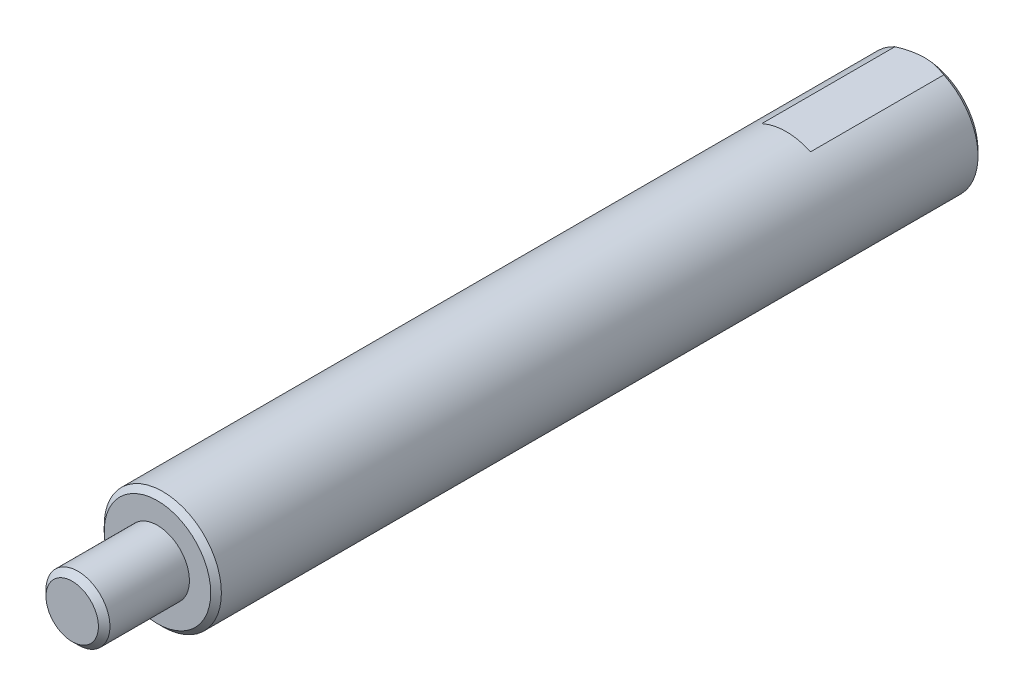
ISO-10303-21;
HEADER;
FILE_DESCRIPTION(('STEP AP214'),'2;1');
FILE_NAME('part.step','',(''),(''),'','','');
FILE_SCHEMA(('AUTOMOTIVE_DESIGN { 1 0 10303 214 1 1 1 1 }'));
ENDSEC;
DATA;
#1=APPLICATION_CONTEXT('core data for automotive mechanical design processes');
#2=APPLICATION_PROTOCOL_DEFINITION('international standard','automotive_design',2000,#1);
#3=PRODUCT_CONTEXT('',#1,'mechanical');
#4=PRODUCT('Part','Part','',(#3));
#5=PRODUCT_RELATED_PRODUCT_CATEGORY('part','',(#4));
#6=PRODUCT_DEFINITION_FORMATION('','',#4);
#7=PRODUCT_DEFINITION_CONTEXT('part definition',#1,'design');
#8=PRODUCT_DEFINITION('design','',#6,#7);
#9=PRODUCT_DEFINITION_SHAPE('','',#8);
#10=(LENGTH_UNIT() NAMED_UNIT(*) SI_UNIT(.MILLI.,.METRE.));
#11=(NAMED_UNIT(*) PLANE_ANGLE_UNIT() SI_UNIT($,.RADIAN.));
#12=(NAMED_UNIT(*) SI_UNIT($,.STERADIAN.) SOLID_ANGLE_UNIT());
#13=UNCERTAINTY_MEASURE_WITH_UNIT(LENGTH_MEASURE(1.E-05),#10,'distance_accuracy_value','');
#14=(GEOMETRIC_REPRESENTATION_CONTEXT(3) GLOBAL_UNCERTAINTY_ASSIGNED_CONTEXT((#13)) GLOBAL_UNIT_ASSIGNED_CONTEXT((#10,
#11,#12)) REPRESENTATION_CONTEXT('',''));
#15=CARTESIAN_POINT('',(0.,0.,0.));
#16=DIRECTION('',(0.,0.,1.));
#17=DIRECTION('',(1.,0.,0.));
#18=AXIS2_PLACEMENT_3D('',#15,#16,#17);
#19=CARTESIAN_POINT('',(0.,0.,0.499999999999987));
#20=DIRECTION('',(0.,0.,1.));
#21=DIRECTION('',(1.,0.,0.));
#22=AXIS2_PLACEMENT_3D('',#19,#20,#21);
#23=CONICAL_SURFACE('',#22,5.5,0.78539816339745);
#24=CARTESIAN_POINT('',(14.6848091307526,5.,10.5126921972504));
#25=CARTESIAN_POINT('',(14.4453208226167,5.,10.2859896541325));
#26=CARTESIAN_POINT('',(14.2055496886511,5.,10.0595855916861));
#27=CARTESIAN_POINT('',(13.7253433237666,5.,9.60748006149905));
#28=CARTESIAN_POINT('',(13.4849080888773,5.,9.38177859797621));
#29=CARTESIAN_POINT('',(12.7618962256915,5.,8.70536049882658));
#30=CARTESIAN_POINT('',(12.2781765081115,5.,8.25586410270802));
#31=CARTESIAN_POINT('',(11.2855202754839,5.,7.34194274282295));
#32=CARTESIAN_POINT('',(10.7764003173807,5.,6.87771631839148));
#33=CARTESIAN_POINT('',(10.0081237078525,5.,6.18705169530895));
#34=CARTESIAN_POINT('',(9.75140731219671,5.,5.95789999795168));
#35=CARTESIAN_POINT('',(9.23598125315536,5.,5.50185127115901));
#36=CARTESIAN_POINT('',(8.97727160895969,5.,5.27495422006517));
#37=CARTESIAN_POINT('',(8.45777334373332,5.,4.82431921159367));
#38=CARTESIAN_POINT('',(8.19698831207967,5.,4.60057712329845));
#39=CARTESIAN_POINT('',(7.67233583018279,5.,4.15670009726201));
#40=CARTESIAN_POINT('',(7.40846821574941,5.,3.93656535317608));
#41=CARTESIAN_POINT('',(6.87588577364978,5.,3.50025684420237));
#42=CARTESIAN_POINT('',(6.60715699098739,5.,3.28410005066111));
#43=CARTESIAN_POINT('',(6.06467897085509,5.,2.85824880719017));
#44=CARTESIAN_POINT('',(5.79093054202079,5.,2.64855333071796));
#45=CARTESIAN_POINT('',(5.24247824545985,5.,2.24225256251797));
#46=CARTESIAN_POINT('',(4.96790940819442,5.,2.04546689887262));
#47=CARTESIAN_POINT('',(4.54965992503179,5.,1.75937405975095));
#48=CARTESIAN_POINT('',(4.40911425501476,5.,1.66548481679902));
#49=CARTESIAN_POINT('',(4.12560555295647,5.,1.48143277641836));
#50=CARTESIAN_POINT('',(3.98264266122834,5.,1.39126976373143));
#51=CARTESIAN_POINT('',(3.69483138879456,5.,1.21601413329325));
#52=CARTESIAN_POINT('',(3.54999993591866,5.,1.130893824596));
#53=CARTESIAN_POINT('',(3.25720950323682,5.,0.966134750499005));
#54=CARTESIAN_POINT('',(3.10925012756179,5.,0.886496684425017));
#55=CARTESIAN_POINT('',(2.81011276522684,5.,0.734125373534754));
#56=CARTESIAN_POINT('',(2.65894061859049,5.,0.661380726321641));
#57=CARTESIAN_POINT('',(2.35286256329063,5.,0.524242686166215));
#58=CARTESIAN_POINT('',(2.1979578875244,5.,0.459846579258829));
#59=CARTESIAN_POINT('',(1.96757107505039,5.,0.372774300731312));
#60=CARTESIAN_POINT('',(1.8935907421667,5.,0.346101437024875));
#61=CARTESIAN_POINT('',(1.74478391072055,5.,0.295222264195111));
#62=CARTESIAN_POINT('',(1.6699573739292,5.,0.271016067006724));
#63=CARTESIAN_POINT('',(1.44419485912741,5.,0.20241783221721));
#64=CARTESIAN_POINT('',(1.29200049197922,5.,0.162055560028218));
#65=CARTESIAN_POINT('',(0.985646477349409,5.,0.0940487123556885));
#66=CARTESIAN_POINT('',(0.831502220582748,5.,0.066335485409596));
#67=CARTESIAN_POINT('',(0.521341182897074,5.,0.0247588689838173));
#68=CARTESIAN_POINT('',(0.365324622093103,5.,0.0108938672889431));
#69=CARTESIAN_POINT('',(0.0516160098074453,5.,-0.00220571628050168));
#70=CARTESIAN_POINT('',(-0.106080254029352,5.,-0.00134130349868332));
#71=CARTESIAN_POINT('',(-0.420679844237957,5.,0.0152055027274913));
#72=CARTESIAN_POINT('',(-0.577583163483161,5.,0.0308880291126336));
#73=CARTESIAN_POINT('',(-0.890071145811222,5.,0.0762385891218209));
#74=CARTESIAN_POINT('',(-1.04564624986794,5.,0.105971488681442));
#75=CARTESIAN_POINT('',(-1.35387421816561,5.,0.177884717281022));
#76=CARTESIAN_POINT('',(-1.50652647420588,5.,0.220067607636083));
#77=CARTESIAN_POINT('',(-1.89899228144049,5.,0.34355635845916));
#78=CARTESIAN_POINT('',(-2.13618939052783,5.,0.43315513583937));
#79=CARTESIAN_POINT('',(-2.60192397109251,5.,0.632544932175513));
#80=CARTESIAN_POINT('',(-2.83045405488686,5.,0.742352730382461));
#81=CARTESIAN_POINT('',(-3.16847602424729,5.,0.918609391765225));
#82=CARTESIAN_POINT('',(-3.28087217249437,5.,0.979600606049442));
#83=CARTESIAN_POINT('',(-3.50386518493594,5.,1.10479681410001));
#84=CARTESIAN_POINT('',(-3.61446202600279,5.,1.16900184913246));
#85=CARTESIAN_POINT('',(-3.8339612658412,5.,1.30012039469567));
#86=CARTESIAN_POINT('',(-3.94286443721366,5.,1.36703261693912));
#87=CARTESIAN_POINT('',(-4.15918024646885,5.,1.50320934076161));
#88=CARTESIAN_POINT('',(-4.26659294268099,5.,1.57247374992055));
#89=CARTESIAN_POINT('',(-4.62241235734309,5.,1.80671898738884));
#90=CARTESIAN_POINT('',(-4.86786587008812,5.,1.97619150842304));
#91=CARTESIAN_POINT('',(-5.35312692377562,5.,2.32306349681885));
#92=CARTESIAN_POINT('',(-5.59293322072365,5.,2.5004646862587));
#93=CARTESIAN_POINT('',(-6.06824445724704,5.,2.86127560728365));
#94=CARTESIAN_POINT('',(-6.30374612411139,5.,3.04468963665742));
#95=CARTESIAN_POINT('',(-6.77116765089326,5.,3.41597165684269));
#96=CARTESIAN_POINT('',(-7.00308779793934,5.,3.60383928751785));
#97=CARTESIAN_POINT('',(-7.46479831203283,5.,3.98364854892019));
#98=CARTESIAN_POINT('',(-7.69457957218839,5.,4.17560122632345));
#99=CARTESIAN_POINT('',(-8.15180534086165,5.,4.56227258082257));
#100=CARTESIAN_POINT('',(-8.37924980937879,5.,4.75699130513138));
#101=CARTESIAN_POINT('',(-8.83212152767317,5.,5.14856830192779));
#102=CARTESIAN_POINT('',(-9.05754957794669,5.,5.34542564979234));
#103=CARTESIAN_POINT('',(-9.50680949169871,5.,5.740954496332));
#104=CARTESIAN_POINT('',(-9.73064134364098,5.,5.93962600809503));
#105=CARTESIAN_POINT('',(-10.3554269609869,5.,6.4979230401996));
#106=CARTESIAN_POINT('',(-10.754889456792,5.,6.85921712232002));
#107=CARTESIAN_POINT('',(-11.550652043519,5.,7.58535654201273));
#108=CARTESIAN_POINT('',(-11.9469517546504,5.,7.95020229473564));
#109=CARTESIAN_POINT('',(-12.7346046209227,5.,8.68021687945507));
#110=CARTESIAN_POINT('',(-13.1259732089032,5.,9.0453690788511));
#111=CARTESIAN_POINT('',(-13.9067337252457,5.,9.77766414097995));
#112=CARTESIAN_POINT('',(-14.2961259422759,5.,10.1448066957958));
#113=CARTESIAN_POINT('',(-14.6848091307526,5.,10.5126921972504));
#114=B_SPLINE_CURVE_WITH_KNOTS('',3,(#24,#25,#26,#27,#28,#29,#30,#31,#32,#33,#34,#35,#36,#37,
#38,#39,#40,#41,#42,#43,#44,#45,#46,#47,#48,#49,#50,#51,#52,#53,#54,#55,#56,#57,#58,#59,#60,#61,
#62,#63,#64,#65,#66,#67,#68,#69,#70,#71,#72,#73,#74,#75,#76,#77,#78,#79,#80,#81,#82,#83,#84,#85,
#86,#87,#88,#89,#90,#91,#92,#93,#94,#95,#96,#97,#98,#99,#100,#101,#102,#103,#104,#105,#106,#107,
#108,#109,#110,#111,#112,#113),.UNSPECIFIED.,.F.,.F.,(4,2,2,2,2,2,2,2,2,2,2,2,2,2,2,2,2,2,2,2,2,
2,2,2,2,2,2,2,2,2,2,2,2,2,2,2,2,2,2,2,2,2,2,2,4),(0.,0.989311923310714,1.97862977419092,
3.95959337600444,6.02651317448656,7.05884240046668,8.09116170015311,9.12197286482421,
10.1528391870693,11.1873903696083,12.2217763312279,13.2349233326133,13.7419424161499,
14.2489321689684,14.7528143978997,15.256760784397,15.759858485699,16.2627922263955,
16.4986794127492,16.7345772986728,17.2064516788896,17.6757336299653,18.1449609407031,
18.6173431093418,19.0897295159999,19.5643184047903,20.039004998071,20.7982977886037,
21.5582238763945,21.941816072922,22.3254131961146,22.7088298733653,23.0922315031281,
23.9868071792121,24.8815781072258,25.7770031658049,26.6723560620082,27.5705534283762,
28.4687661443107,29.3666048627681,30.2644500636279,31.8802558929101,33.4962529155443,
35.1020309687598,36.7075673131427),.UNSPECIFIED.);
#115=CARTESIAN_POINT('',(2.29128784747799,5.,0.499999999999968));
#116=VERTEX_POINT('',#115);
#117=CARTESIAN_POINT('',(0.,5.00000000000001,0.));
#118=VERTEX_POINT('',#117);
#119=EDGE_CURVE('E56',#116,#118,#114,.T.);
#120=ORIENTED_EDGE('',*,*,#119,.F.);
#121=CARTESIAN_POINT('',(0.,0.,0.499999999999987));
#122=DIRECTION('',(0.,0.,1.));
#123=DIRECTION('',(1.,0.,0.));
#124=AXIS2_PLACEMENT_3D('',#121,#122,#123);
#125=CIRCLE('',#124,5.5);
#126=CARTESIAN_POINT('',(2.29128784747792,-5.,0.499999999999986));
#127=VERTEX_POINT('',#126);
#128=EDGE_CURVE('E125',#127,#116,#125,.T.);
#129=ORIENTED_EDGE('',*,*,#128,.F.);
#130=CARTESIAN_POINT('',(-14.6848091307526,-5.,10.5126921972504));
#131=CARTESIAN_POINT('',(-14.4453208226167,-5.,10.2859896541325));
#132=CARTESIAN_POINT('',(-14.2055496886511,-5.,10.0595855916861));
#133=CARTESIAN_POINT('',(-13.7253433237666,-5.,9.60748006149905));
#134=CARTESIAN_POINT('',(-13.4849080888773,-5.,9.38177859797621));
#135=CARTESIAN_POINT('',(-12.7618962256915,-5.,8.70536049882658));
#136=CARTESIAN_POINT('',(-12.2781765081115,-5.,8.25586410270802));
#137=CARTESIAN_POINT('',(-11.2855202754839,-5.,7.34194274282295));
#138=CARTESIAN_POINT('',(-10.7764003173807,-5.,6.87771631839148));
#139=CARTESIAN_POINT('',(-10.0081237078525,-5.,6.18705169530895));
#140=CARTESIAN_POINT('',(-9.75140731219672,-5.,5.95789999795169));
#141=CARTESIAN_POINT('',(-9.23598125315536,-5.,5.50185127115901));
#142=CARTESIAN_POINT('',(-8.9772716089597,-5.,5.27495422006518));
#143=CARTESIAN_POINT('',(-8.45777334373332,-5.,4.82431921159367));
#144=CARTESIAN_POINT('',(-8.19698831207967,-5.,4.60057712329845));
#145=CARTESIAN_POINT('',(-7.6723358301828,-5.,4.15670009726201));
#146=CARTESIAN_POINT('',(-7.40846821574941,-5.,3.93656535317608));
#147=CARTESIAN_POINT('',(-6.87588577364978,-5.,3.50025684420237));
#148=CARTESIAN_POINT('',(-6.60715699098739,-5.,3.28410005066111));
#149=CARTESIAN_POINT('',(-6.0646789708551,-5.,2.85824880719017));
#150=CARTESIAN_POINT('',(-5.79093054202079,-5.,2.64855333071797));
#151=CARTESIAN_POINT('',(-5.24247824545985,-5.,2.24225256251797));
#152=CARTESIAN_POINT('',(-4.96790940819442,-5.,2.04546689887262));
#153=CARTESIAN_POINT('',(-4.5496599250318,-5.,1.75937405975095));
#154=CARTESIAN_POINT('',(-4.40911425501477,-5.,1.66548481679902));
#155=CARTESIAN_POINT('',(-4.12560555295648,-5.,1.48143277641836));
#156=CARTESIAN_POINT('',(-3.98264266122835,-5.,1.39126976373143));
#157=CARTESIAN_POINT('',(-3.69483138879457,-5.,1.21601413329326));
#158=CARTESIAN_POINT('',(-3.54999993591867,-5.,1.13089382459601));
#159=CARTESIAN_POINT('',(-3.25720950323683,-5.,0.966134750499011));
#160=CARTESIAN_POINT('',(-3.1092501275618,-5.,0.886496684425023));
#161=CARTESIAN_POINT('',(-2.81011276522685,-5.,0.734125373534759));
#162=CARTESIAN_POINT('',(-2.6589406185905,-5.,0.661380726321646));
#163=CARTESIAN_POINT('',(-2.35286256329064,-5.,0.52424268616622));
#164=CARTESIAN_POINT('',(-2.19795788752441,-5.,0.459846579258833));
#165=CARTESIAN_POINT('',(-1.9675710750504,-5.,0.372774300731315));
#166=CARTESIAN_POINT('',(-1.89359074216671,-5.,0.346101437024878));
#167=CARTESIAN_POINT('',(-1.74478391072056,-5.,0.295222264195114));
#168=CARTESIAN_POINT('',(-1.66995737392921,-5.,0.271016067006727));
#169=CARTESIAN_POINT('',(-1.44419485912741,-5.,0.202417832217213));
#170=CARTESIAN_POINT('',(-1.29200049197923,-5.,0.16205556002822));
#171=CARTESIAN_POINT('',(-0.985646477349418,-5.,0.0940487123556907));
#172=CARTESIAN_POINT('',(-0.831502220582757,-5.,0.0663354854095982));
#173=CARTESIAN_POINT('',(-0.521341182897083,-5.,0.0247588689838186));
#174=CARTESIAN_POINT('',(-0.365324622093111,-5.,0.0108938672889437));
#175=CARTESIAN_POINT('',(-0.0516160098074518,-5.,-0.00220571628050229));
#176=CARTESIAN_POINT('',(0.106080254029347,-5.,-0.00134130349868432));
#177=CARTESIAN_POINT('',(0.420679844237952,-5.,0.0152055027274903));
#178=CARTESIAN_POINT('',(0.577583163483156,-5.,0.0308880291126329));
#179=CARTESIAN_POINT('',(0.890071145811216,-5.,0.0762385891218198));
#180=CARTESIAN_POINT('',(1.04564624986793,-5.,0.10597148868144));
#181=CARTESIAN_POINT('',(1.3538742181656,-5.,0.17788471728102));
#182=CARTESIAN_POINT('',(1.50652647420588,-5.,0.220067607636081));
#183=CARTESIAN_POINT('',(1.89899228144048,-5.,0.343556358459158));
#184=CARTESIAN_POINT('',(2.13618939052782,-5.,0.433155135839368));
#185=CARTESIAN_POINT('',(2.60192397109251,-5.,0.63254493217551));
#186=CARTESIAN_POINT('',(2.83045405488685,-5.,0.742352730382457));
#187=CARTESIAN_POINT('',(3.16847602424728,-5.,0.918609391765221));
#188=CARTESIAN_POINT('',(3.28087217249436,-5.,0.979600606049437));
#189=CARTESIAN_POINT('',(3.50386518493593,-5.,1.1047968141));
#190=CARTESIAN_POINT('',(3.61446202600278,-5.,1.16900184913246));
#191=CARTESIAN_POINT('',(3.83396126584119,-5.,1.30012039469567));
#192=CARTESIAN_POINT('',(3.94286443721365,-5.,1.36703261693911));
#193=CARTESIAN_POINT('',(4.15918024646884,-5.,1.5032093407616));
#194=CARTESIAN_POINT('',(4.26659294268098,-5.,1.57247374992054));
#195=CARTESIAN_POINT('',(4.62241235734308,-5.,1.80671898738884));
#196=CARTESIAN_POINT('',(4.86786587008811,-5.,1.97619150842303));
#197=CARTESIAN_POINT('',(5.35312692377561,-5.,2.32306349681884));
#198=CARTESIAN_POINT('',(5.59293322072363,-5.,2.5004646862587));
#199=CARTESIAN_POINT('',(6.06824445724703,-5.,2.86127560728364));
#200=CARTESIAN_POINT('',(6.30374612411138,-5.,3.04468963665741));
#201=CARTESIAN_POINT('',(6.77116765089325,-5.,3.41597165684268));
#202=CARTESIAN_POINT('',(7.00308779793934,-5.,3.60383928751784));
#203=CARTESIAN_POINT('',(7.46479831203282,-5.,3.98364854892018));
#204=CARTESIAN_POINT('',(7.69457957218838,-5.,4.17560122632344));
#205=CARTESIAN_POINT('',(8.15180534086164,-5.,4.56227258082257));
#206=CARTESIAN_POINT('',(8.37924980937878,-5.,4.75699130513138));
#207=CARTESIAN_POINT('',(8.83212152767316,-5.,5.14856830192779));
#208=CARTESIAN_POINT('',(9.05754957794669,-5.,5.34542564979233));
#209=CARTESIAN_POINT('',(9.50680949169871,-5.,5.74095449633199));
#210=CARTESIAN_POINT('',(9.73064134364097,-5.,5.93962600809503));
#211=CARTESIAN_POINT('',(10.3554269609869,-5.,6.4979230401996));
#212=CARTESIAN_POINT('',(10.754889456792,-5.,6.85921712232001));
#213=CARTESIAN_POINT('',(11.550652043519,-5.,7.58535654201273));
#214=CARTESIAN_POINT('',(11.9469517546504,-5.,7.95020229473563));
#215=CARTESIAN_POINT('',(12.7346046209227,-5.,8.68021687945506));
#216=CARTESIAN_POINT('',(13.1259732089032,-5.,9.04536907885109));
#217=CARTESIAN_POINT('',(13.9067337252457,-5.,9.77766414097995));
#218=CARTESIAN_POINT('',(14.2961259422759,-5.,10.1448066957958));
#219=CARTESIAN_POINT('',(14.6848091307526,-5.,10.5126921972504));
#220=B_SPLINE_CURVE_WITH_KNOTS('',3,(#130,#131,#132,#133,#134,#135,#136,#137,#138,#139,#140,
#141,#142,#143,#144,#145,#146,#147,#148,#149,#150,#151,#152,#153,#154,#155,#156,#157,#158,#159,
#160,#161,#162,#163,#164,#165,#166,#167,#168,#169,#170,#171,#172,#173,#174,#175,#176,#177,#178,
#179,#180,#181,#182,#183,#184,#185,#186,#187,#188,#189,#190,#191,#192,#193,#194,#195,#196,#197,
#198,#199,#200,#201,#202,#203,#204,#205,#206,#207,#208,#209,#210,#211,#212,#213,#214,#215,#216,
#217,#218,#219),.UNSPECIFIED.,.F.,.F.,(4,2,2,2,2,2,2,2,2,2,2,2,2,2,2,2,2,2,2,2,2,2,2,2,2,2,2,2,
2,2,2,2,2,2,2,2,2,2,2,2,2,2,2,2,4),(0.,0.98931192331071,1.97862977419091,3.95959337600444,
6.02651317448655,7.05884240046668,8.0911617001531,9.1219728648242,10.1528391870693,
11.1873903696083,12.2217763312279,13.2349233326133,13.7419424161499,14.2489321689684,
14.7528143978997,15.2567607843969,15.759858485699,16.2627922263955,16.4986794127492,
16.7345772986728,17.2064516788896,17.6757336299653,18.1449609407031,18.6173431093418,
19.0897295159999,19.5643184047903,20.0390049980709,20.7982977886037,21.5582238763945,
21.941816072922,22.3254131961146,22.7088298733652,23.092231503128,23.9868071792121,
24.8815781072258,25.7770031658048,26.6723560620081,27.5705534283762,28.4687661443107,
29.3666048627681,30.2644500636279,31.8802558929101,33.4962529155443,35.1020309687598,
36.7075673131427),.UNSPECIFIED.);
#221=CARTESIAN_POINT('',(0.,-5.00000000000001,0.));
#222=VERTEX_POINT('',#221);
#223=EDGE_CURVE('E141',#222,#127,#220,.T.);
#224=ORIENTED_EDGE('',*,*,#223,.F.);
#225=CARTESIAN_POINT('',(0.,0.,0.));
#226=DIRECTION('',(0.,0.,1.));
#227=DIRECTION('',(1.,0.,0.));
#228=AXIS2_PLACEMENT_3D('',#225,#226,#227);
#229=CIRCLE('',#228,5.00000000000001);
#230=EDGE_CURVE('E132',#118,#222,#229,.F.);
#231=ORIENTED_EDGE('',*,*,#230,.F.);
#232=EDGE_LOOP('',(#120,#129,#224,#231));
#233=FACE_BOUND('',#232,.T.);
#234=ADVANCED_FACE('F41',(#233),#23,.T.);
#235=CARTESIAN_POINT('',(0.,0.,72.));
#236=DIRECTION('',(0.,0.,1.));
#237=DIRECTION('',(1.,0.,0.));
#238=AXIS2_PLACEMENT_3D('',#235,#236,#237);
#239=PLANE('',#238);
#240=CARTESIAN_POINT('',(0.,0.,72.));
#241=DIRECTION('',(0.,0.,1.));
#242=DIRECTION('',(1.,0.,0.));
#243=AXIS2_PLACEMENT_3D('',#240,#241,#242);
#244=CIRCLE('',#243,5.);
#245=CARTESIAN_POINT('',(5.,0.,72.));
#246=VERTEX_POINT('',#245);
#247=EDGE_CURVE('E131',#246,#246,#244,.T.);
#248=ORIENTED_EDGE('',*,*,#247,.T.);
#249=EDGE_LOOP('',(#248));
#250=FACE_BOUND('',#249,.T.);
#251=CARTESIAN_POINT('',(0.,0.,72.));
#252=DIRECTION('',(0.,0.,-1.));
#253=DIRECTION('',(-1.,0.,0.));
#254=AXIS2_PLACEMENT_3D('',#251,#252,#253);
#255=CIRCLE('',#254,3.);
#256=CARTESIAN_POINT('',(-3.,0.,72.));
#257=VERTEX_POINT('',#256);
#258=EDGE_CURVE('E100',#257,#257,#255,.T.);
#259=ORIENTED_EDGE('',*,*,#258,.T.);
#260=EDGE_LOOP('',(#259));
#261=FACE_BOUND('',#260,.T.);
#262=ADVANCED_FACE('F177',(#250,#261),#239,.T.);
#263=CARTESIAN_POINT('',(0.,0.,72.));
#264=DIRECTION('',(0.,0.,-1.));
#265=DIRECTION('',(-1.,0.,0.));
#266=AXIS2_PLACEMENT_3D('',#263,#264,#265);
#267=CYLINDRICAL_SURFACE('',#266,5.5);
#268=CARTESIAN_POINT('',(0.,0.,13.));
#269=DIRECTION('',(0.,0.,-1.));
#270=DIRECTION('',(-1.,0.,0.));
#271=AXIS2_PLACEMENT_3D('',#268,#269,#270);
#272=CIRCLE('',#271,5.5);
#273=CARTESIAN_POINT('',(-2.29128784747792,5.,13.));
#274=VERTEX_POINT('',#273);
#275=CARTESIAN_POINT('',(2.29128784747792,5.,13.));
#276=VERTEX_POINT('',#275);
#277=EDGE_CURVE('E11',#274,#276,#272,.T.);
#278=ORIENTED_EDGE('',*,*,#277,.F.);
#279=DIRECTION('',(0.,0.,-1.));
#280=VECTOR('',#279,1.);
#281=CARTESIAN_POINT('',(-2.29128784747792,5.,72.));
#282=LINE('',#281,#280);
#283=CARTESIAN_POINT('',(-2.29128784747792,5.,0.499999999999986));
#284=VERTEX_POINT('',#283);
#285=EDGE_CURVE('E117',#274,#284,#282,.T.);
#286=ORIENTED_EDGE('',*,*,#285,.T.);
#287=CARTESIAN_POINT('',(-2.29128784747799,-5.,0.499999999999967));
#288=VERTEX_POINT('',#287);
#289=EDGE_CURVE('E108',#284,#288,#125,.T.);
#290=ORIENTED_EDGE('',*,*,#289,.T.);
#291=DIRECTION('',(0.,0.,-1.));
#292=VECTOR('',#291,1.);
#293=CARTESIAN_POINT('',(-2.29128784747792,-5.,72.));
#294=LINE('',#293,#292);
#295=CARTESIAN_POINT('',(-2.29128784747792,-5.,13.));
#296=VERTEX_POINT('',#295);
#297=EDGE_CURVE('E97',#288,#296,#294,.F.);
#298=ORIENTED_EDGE('',*,*,#297,.T.);
#299=CARTESIAN_POINT('',(0.,0.,13.));
#300=DIRECTION('',(0.,0.,1.));
#301=DIRECTION('',(1.,0.,0.));
#302=AXIS2_PLACEMENT_3D('',#299,#300,#301);
#303=CIRCLE('',#302,5.5);
#304=CARTESIAN_POINT('',(2.29128784747792,-5.,13.));
#305=VERTEX_POINT('',#304);
#306=EDGE_CURVE('E49',#296,#305,#303,.T.);
#307=ORIENTED_EDGE('',*,*,#306,.T.);
#308=DIRECTION('',(0.,0.,-1.));
#309=VECTOR('',#308,1.);
#310=CARTESIAN_POINT('',(2.29128784747792,-5.,72.));
#311=LINE('',#310,#309);
#312=EDGE_CURVE('E98',#305,#127,#311,.T.);
#313=ORIENTED_EDGE('',*,*,#312,.T.);
#314=ORIENTED_EDGE('',*,*,#128,.T.);
#315=DIRECTION('',(0.,0.,-1.));
#316=VECTOR('',#315,1.);
#317=CARTESIAN_POINT('',(2.29128784747792,5.,72.));
#318=LINE('',#317,#316);
#319=EDGE_CURVE('E110',#116,#276,#318,.F.);
#320=ORIENTED_EDGE('',*,*,#319,.T.);
#321=EDGE_LOOP('',(#278,#286,#290,#298,#307,#313,#314,#320));
#322=FACE_BOUND('',#321,.T.);
#323=CARTESIAN_POINT('',(0.,0.,71.5));
#324=DIRECTION('',(0.,0.,1.));
#325=DIRECTION('',(1.,0.,0.));
#326=AXIS2_PLACEMENT_3D('',#323,#324,#325);
#327=CIRCLE('',#326,5.5);
#328=CARTESIAN_POINT('',(5.5,0.,71.5));
#329=VERTEX_POINT('',#328);
#330=EDGE_CURVE('E122',#329,#329,#327,.F.);
#331=ORIENTED_EDGE('',*,*,#330,.T.);
#332=EDGE_LOOP('',(#331));
#333=FACE_BOUND('',#332,.T.);
#334=ADVANCED_FACE('F104',(#322,#333),#267,.T.);
#335=CARTESIAN_POINT('',(0.,0.,0.));
#336=DIRECTION('',(0.,0.,1.));
#337=DIRECTION('',(1.,0.,0.));
#338=AXIS2_PLACEMENT_3D('',#335,#336,#337);
#339=PLANE('',#338);
#340=CARTESIAN_POINT('',(0.,0.,0.));
#341=DIRECTION('',(0.,0.,1.));
#342=DIRECTION('',(1.,0.,0.));
#343=AXIS2_PLACEMENT_3D('',#340,#341,#342);
#344=CIRCLE('',#343,2.6);
#345=CARTESIAN_POINT('',(2.6,0.,0.));
#346=VERTEX_POINT('',#345);
#347=EDGE_CURVE('E138',#346,#346,#344,.T.);
#348=ORIENTED_EDGE('',*,*,#347,.T.);
#349=EDGE_LOOP('',(#348));
#350=FACE_BOUND('',#349,.T.);
#351=EDGE_CURVE('E128',#222,#118,#229,.F.);
#352=ORIENTED_EDGE('',*,*,#351,.T.);
#353=ORIENTED_EDGE('',*,*,#230,.T.);
#354=EDGE_LOOP('',(#352,#353));
#355=FACE_BOUND('',#354,.T.);
#356=ADVANCED_FACE('F181',(#350,#355),#339,.F.);
#357=EDGE_CURVE('E149',#118,#284,#114,.T.);
#358=ORIENTED_EDGE('',*,*,#357,.F.);
#359=ORIENTED_EDGE('',*,*,#351,.F.);
#360=EDGE_CURVE('E64',#288,#222,#220,.T.);
#361=ORIENTED_EDGE('',*,*,#360,.F.);
#362=ORIENTED_EDGE('',*,*,#289,.F.);
#363=EDGE_LOOP('',(#358,#359,#361,#362));
#364=FACE_BOUND('',#363,.T.);
#365=ADVANCED_FACE('F155',(#364),#23,.T.);
#366=CARTESIAN_POINT('',(0.,0.,72.));
#367=DIRECTION('',(0.,0.,-1.));
#368=DIRECTION('',(-1.,0.,0.));
#369=AXIS2_PLACEMENT_3D('',#366,#367,#368);
#370=CONICAL_SURFACE('',#369,5.,0.785398163397443);
#371=ORIENTED_EDGE('',*,*,#330,.F.);
#372=EDGE_LOOP('',(#371));
#373=FACE_BOUND('',#372,.T.);
#374=ORIENTED_EDGE('',*,*,#247,.F.);
#375=EDGE_LOOP('',(#374));
#376=FACE_BOUND('',#375,.T.);
#377=ADVANCED_FACE('F170',(#373,#376),#370,.T.);
#378=CARTESIAN_POINT('',(0.,0.,12.4));
#379=DIRECTION('',(0.,0.,-1.));
#380=DIRECTION('',(-1.,0.,0.));
#381=AXIS2_PLACEMENT_3D('',#378,#379,#380);
#382=CONICAL_SURFACE('',#381,2.1,1.02974425867665);
#383=CARTESIAN_POINT('',(0.,0.,13.6618072999579));
#384=VERTEX_POINT('',#383);
#385=VERTEX_LOOP('',#384);
#386=FACE_BOUND('',#385,.T.);
#387=CARTESIAN_POINT('',(0.,0.,12.4));
#388=DIRECTION('',(0.,0.,-1.));
#389=DIRECTION('',(-1.,0.,0.));
#390=AXIS2_PLACEMENT_3D('',#387,#388,#389);
#391=CIRCLE('',#390,2.1);
#392=CARTESIAN_POINT('',(-2.1,0.,12.4));
#393=VERTEX_POINT('',#392);
#394=EDGE_CURVE('E119',#393,#393,#391,.T.);
#395=ORIENTED_EDGE('',*,*,#394,.T.);
#396=EDGE_LOOP('',(#395));
#397=FACE_BOUND('',#396,.T.);
#398=ADVANCED_FACE('F166',(#386,#397),#382,.F.);
#399=CARTESIAN_POINT('',(0.,0.,0.));
#400=DIRECTION('',(0.,0.,-1.));
#401=DIRECTION('',(-1.,0.,0.));
#402=AXIS2_PLACEMENT_3D('',#399,#400,#401);
#403=CYLINDRICAL_SURFACE('',#402,2.1);
#404=CARTESIAN_POINT('',(0.,0.,0.500000000000007));
#405=DIRECTION('',(0.,0.,1.));
#406=DIRECTION('',(1.,0.,0.));
#407=AXIS2_PLACEMENT_3D('',#404,#405,#406);
#408=CIRCLE('',#407,2.1);
#409=CARTESIAN_POINT('',(2.1,0.,0.500000000000007));
#410=VERTEX_POINT('',#409);
#411=EDGE_CURVE('E135',#410,#410,#408,.F.);
#412=ORIENTED_EDGE('',*,*,#411,.T.);
#413=EDGE_LOOP('',(#412));
#414=FACE_BOUND('',#413,.T.);
#415=ORIENTED_EDGE('',*,*,#394,.F.);
#416=EDGE_LOOP('',(#415));
#417=FACE_BOUND('',#416,.T.);
#418=ADVANCED_FACE('F163',(#414,#417),#403,.F.);
#419=CARTESIAN_POINT('',(0.,0.,0.500000000000007));
#420=DIRECTION('',(0.,0.,-1.));
#421=DIRECTION('',(-1.,0.,0.));
#422=AXIS2_PLACEMENT_3D('',#419,#420,#421);
#423=CONICAL_SURFACE('',#422,2.1,0.785398163397448);
#424=ORIENTED_EDGE('',*,*,#347,.F.);
#425=EDGE_LOOP('',(#424));
#426=FACE_BOUND('',#425,.T.);
#427=ORIENTED_EDGE('',*,*,#411,.F.);
#428=EDGE_LOOP('',(#427));
#429=FACE_BOUND('',#428,.T.);
#430=ADVANCED_FACE('F43',(#426,#429),#423,.F.);
#431=CARTESIAN_POINT('',(0.,0.,13.));
#432=DIRECTION('',(0.,0.,1.));
#433=DIRECTION('',(1.,0.,0.));
#434=AXIS2_PLACEMENT_3D('',#431,#432,#433);
#435=PLANE('',#434);
#436=DIRECTION('',(1.,0.,0.));
#437=VECTOR('',#436,1.);
#438=CARTESIAN_POINT('',(5.,-5.,13.));
#439=LINE('',#438,#437);
#440=EDGE_CURVE('E92',#296,#305,#439,.T.);
#441=ORIENTED_EDGE('',*,*,#440,.T.);
#442=ORIENTED_EDGE('',*,*,#306,.F.);
#443=EDGE_LOOP('',(#441,#442));
#444=FACE_BOUND('',#443,.T.);
#445=ADVANCED_FACE('F91',(#444),#435,.F.);
#446=CARTESIAN_POINT('',(5.,-5.,13.));
#447=DIRECTION('',(0.,1.,0.));
#448=DIRECTION('',(0.,0.,1.));
#449=AXIS2_PLACEMENT_3D('',#446,#447,#448);
#450=PLANE('',#449);
#451=ORIENTED_EDGE('',*,*,#440,.F.);
#452=ORIENTED_EDGE('',*,*,#297,.F.);
#453=ORIENTED_EDGE('',*,*,#360,.T.);
#454=ORIENTED_EDGE('',*,*,#223,.T.);
#455=ORIENTED_EDGE('',*,*,#312,.F.);
#456=EDGE_LOOP('',(#451,#452,#453,#454,#455));
#457=FACE_BOUND('',#456,.T.);
#458=ADVANCED_FACE('F96',(#457),#450,.F.);
#459=CARTESIAN_POINT('',(0.,0.,13.));
#460=DIRECTION('',(0.,0.,-1.));
#461=DIRECTION('',(-1.,0.,0.));
#462=AXIS2_PLACEMENT_3D('',#459,#460,#461);
#463=PLANE('',#462);
#464=ORIENTED_EDGE('',*,*,#277,.T.);
#465=DIRECTION('',(-1.,0.,0.));
#466=VECTOR('',#465,1.);
#467=CARTESIAN_POINT('',(5.,5.,13.));
#468=LINE('',#467,#466);
#469=EDGE_CURVE('E99',#276,#274,#468,.T.);
#470=ORIENTED_EDGE('',*,*,#469,.T.);
#471=EDGE_LOOP('',(#464,#470));
#472=FACE_BOUND('',#471,.T.);
#473=ADVANCED_FACE('F162',(#472),#463,.T.);
#474=CARTESIAN_POINT('',(5.,5.,13.));
#475=DIRECTION('',(0.,-1.,0.));
#476=DIRECTION('',(0.,0.,-1.));
#477=AXIS2_PLACEMENT_3D('',#474,#475,#476);
#478=PLANE('',#477);
#479=ORIENTED_EDGE('',*,*,#469,.F.);
#480=ORIENTED_EDGE('',*,*,#319,.F.);
#481=ORIENTED_EDGE('',*,*,#119,.T.);
#482=ORIENTED_EDGE('',*,*,#357,.T.);
#483=ORIENTED_EDGE('',*,*,#285,.F.);
#484=EDGE_LOOP('',(#479,#480,#481,#482,#483));
#485=FACE_BOUND('',#484,.T.);
#486=ADVANCED_FACE('F203',(#485),#478,.F.);
#487=CARTESIAN_POINT('',(0.,0.,80.));
#488=DIRECTION('',(0.,0.,-1.));
#489=DIRECTION('',(-1.,0.,0.));
#490=AXIS2_PLACEMENT_3D('',#487,#488,#489);
#491=CYLINDRICAL_SURFACE('',#490,3.);
#492=ORIENTED_EDGE('',*,*,#258,.F.);
#493=EDGE_LOOP('',(#492));
#494=FACE_BOUND('',#493,.T.);
#495=CARTESIAN_POINT('',(0.,0.,79.4585));
#496=DIRECTION('',(0.,0.,-1.));
#497=DIRECTION('',(-1.,0.,0.));
#498=AXIS2_PLACEMENT_3D('',#495,#496,#497);
#499=CIRCLE('',#498,3.);
#500=CARTESIAN_POINT('',(-3.,0.,79.4585));
#501=VERTEX_POINT('',#500);
#502=EDGE_CURVE('E223',#501,#501,#499,.T.);
#503=ORIENTED_EDGE('',*,*,#502,.T.);
#504=EDGE_LOOP('',(#503));
#505=FACE_BOUND('',#504,.T.);
#506=ADVANCED_FACE('F210',(#494,#505),#491,.T.);
#507=CARTESIAN_POINT('',(0.,0.,80.));
#508=DIRECTION('',(0.,0.,-1.));
#509=DIRECTION('',(-1.,0.,0.));
#510=AXIS2_PLACEMENT_3D('',#507,#508,#509);
#511=CONICAL_SURFACE('',#510,2.4585,0.785398163397448);
#512=ORIENTED_EDGE('',*,*,#502,.F.);
#513=EDGE_LOOP('',(#512));
#514=FACE_BOUND('',#513,.T.);
#515=CARTESIAN_POINT('',(0.,0.,80.));
#516=DIRECTION('',(0.,0.,-1.));
#517=DIRECTION('',(-1.,0.,0.));
#518=AXIS2_PLACEMENT_3D('',#515,#516,#517);
#519=CIRCLE('',#518,2.4585);
#520=CARTESIAN_POINT('',(-2.4585,0.,80.));
#521=VERTEX_POINT('',#520);
#522=EDGE_CURVE('E226',#521,#521,#519,.T.);
#523=ORIENTED_EDGE('',*,*,#522,.T.);
#524=EDGE_LOOP('',(#523));
#525=FACE_BOUND('',#524,.T.);
#526=ADVANCED_FACE('F175',(#514,#525),#511,.T.);
#527=CARTESIAN_POINT('',(0.,0.,80.));
#528=DIRECTION('',(0.,0.,1.));
#529=DIRECTION('',(1.,0.,0.));
#530=AXIS2_PLACEMENT_3D('',#527,#528,#529);
#531=PLANE('',#530);
#532=ORIENTED_EDGE('',*,*,#522,.F.);
#533=EDGE_LOOP('',(#532));
#534=FACE_BOUND('',#533,.T.);
#535=ADVANCED_FACE('F172',(#534),#531,.T.);
#536=CLOSED_SHELL('',(#234,#262,#334,#356,#365,#377,#398,#418,#430,#445,#458,#473,#486,#506,
#526,#535));
#537=MANIFOLD_SOLID_BREP('B2',#536);
#538=ADVANCED_BREP_SHAPE_REPRESENTATION('',(#18,#537),#14);
#539=SHAPE_DEFINITION_REPRESENTATION(#9,#538);
ENDSEC;
END-ISO-10303-21;
